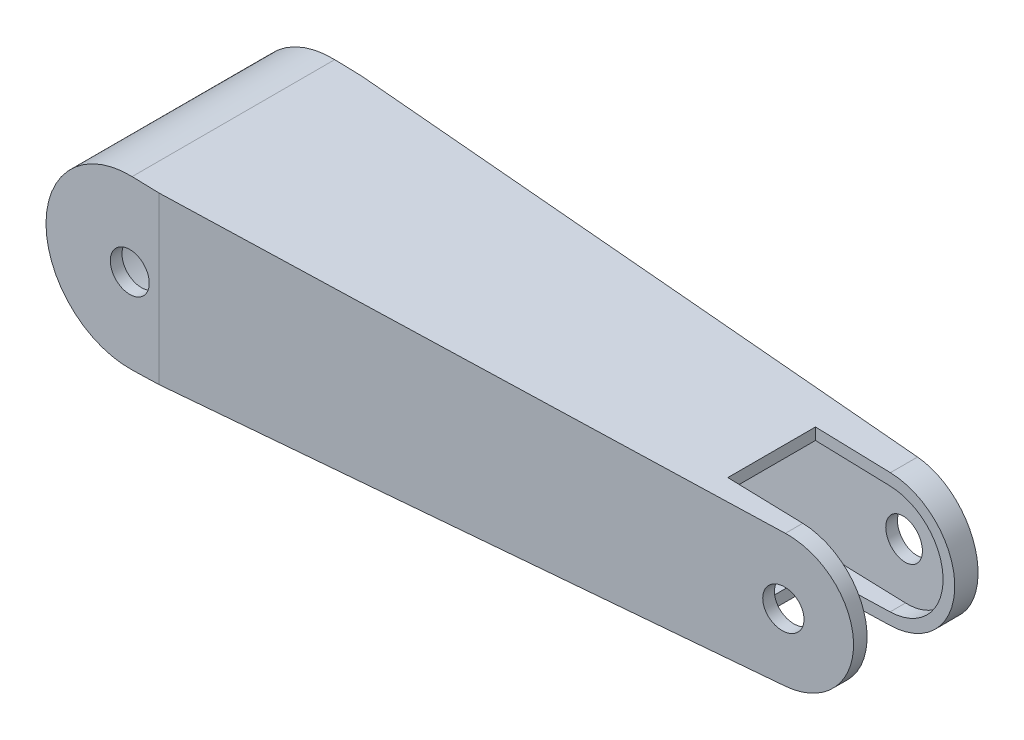
ISO-10303-21;
HEADER;
FILE_DESCRIPTION(('STEP AP214'),'2;1');
FILE_NAME('part.step','',(''),(''),'','','');
FILE_SCHEMA(('AUTOMOTIVE_DESIGN { 1 0 10303 214 1 1 1 1 }'));
ENDSEC;
DATA;
#1=APPLICATION_CONTEXT('core data for automotive mechanical design processes');
#2=APPLICATION_PROTOCOL_DEFINITION('international standard','automotive_design',2000,#1);
#3=PRODUCT_CONTEXT('',#1,'mechanical');
#4=PRODUCT('Part','Part','',(#3));
#5=PRODUCT_RELATED_PRODUCT_CATEGORY('part','',(#4));
#6=PRODUCT_DEFINITION_FORMATION('','',#4);
#7=PRODUCT_DEFINITION_CONTEXT('part definition',#1,'design');
#8=PRODUCT_DEFINITION('design','',#6,#7);
#9=PRODUCT_DEFINITION_SHAPE('','',#8);
#10=(LENGTH_UNIT() NAMED_UNIT(*) SI_UNIT(.MILLI.,.METRE.));
#11=(NAMED_UNIT(*) PLANE_ANGLE_UNIT() SI_UNIT($,.RADIAN.));
#12=(NAMED_UNIT(*) SI_UNIT($,.STERADIAN.) SOLID_ANGLE_UNIT());
#13=UNCERTAINTY_MEASURE_WITH_UNIT(LENGTH_MEASURE(1.E-05),#10,'distance_accuracy_value','');
#14=(GEOMETRIC_REPRESENTATION_CONTEXT(3) GLOBAL_UNCERTAINTY_ASSIGNED_CONTEXT((#13)) GLOBAL_UNIT_ASSIGNED_CONTEXT((#10,
#11,#12)) REPRESENTATION_CONTEXT('',''));
#15=CARTESIAN_POINT('',(0.,0.,0.));
#16=DIRECTION('',(0.,0.,1.));
#17=DIRECTION('',(1.,0.,0.));
#18=AXIS2_PLACEMENT_3D('',#15,#16,#17);
#19=CARTESIAN_POINT('',(210.710752688172,0.,200.));
#20=DIRECTION('',(0.,0.,-1.));
#21=DIRECTION('',(-1.,0.,0.));
#22=AXIS2_PLACEMENT_3D('',#19,#20,#21);
#23=CYLINDRICAL_SURFACE('',#22,28.);
#24=CARTESIAN_POINT('',(210.710752688172,0.,80.));
#25=DIRECTION('',(0.,0.,-1.));
#26=DIRECTION('',(-1.,0.,0.));
#27=AXIS2_PLACEMENT_3D('',#24,#25,#26);
#28=CIRCLE('',#27,28.);
#29=CARTESIAN_POINT('',(211.504453475574,27.9887484368287,80.));
#30=VERTEX_POINT('',#29);
#31=CARTESIAN_POINT('',(211.504453475574,-27.9887484368287,80.));
#32=VERTEX_POINT('',#31);
#33=EDGE_CURVE('E188',#30,#32,#28,.T.);
#34=ORIENTED_EDGE('',*,*,#33,.F.);
#35=DIRECTION('',(0.,0.,1.));
#36=VECTOR('',#35,1.);
#37=CARTESIAN_POINT('',(211.504453475574,27.9887484368287,200.));
#38=LINE('',#37,#36);
#39=CARTESIAN_POINT('',(211.504453475574,27.9887484368287,72.0727862655077));
#40=VERTEX_POINT('',#39);
#41=EDGE_CURVE('E293',#30,#40,#38,.F.);
#42=ORIENTED_EDGE('',*,*,#41,.T.);
#43=CARTESIAN_POINT('',(210.710752688172,0.,72.0255187248187));
#44=DIRECTION('',(0.0594480239556264,0.,-0.998231402254894));
#45=DIRECTION('',(-0.998231402254894,0.,-0.0594480239556264));
#46=AXIS2_PLACEMENT_3D('',#43,#44,#45);
#47=ELLIPSE('',#46,28.0496084742988,28.);
#48=CARTESIAN_POINT('',(211.504453475574,-27.9887484368287,72.0727862655077));
#49=VERTEX_POINT('',#48);
#50=EDGE_CURVE('E256',#40,#49,#47,.T.);
#51=ORIENTED_EDGE('',*,*,#50,.T.);
#52=DIRECTION('',(0.,0.,-1.));
#53=VECTOR('',#52,1.);
#54=CARTESIAN_POINT('',(211.504453475574,-27.9887484368287,200.));
#55=LINE('',#54,#53);
#56=EDGE_CURVE('E297',#32,#49,#55,.T.);
#57=ORIENTED_EDGE('',*,*,#56,.F.);
#58=EDGE_LOOP('',(#34,#42,#51,#57));
#59=FACE_BOUND('',#58,.T.);
#60=ADVANCED_FACE('F42',(#59),#23,.F.);
#61=CARTESIAN_POINT('',(-106.789247311828,0.,200.));
#62=DIRECTION('',(0.,0.,-1.));
#63=DIRECTION('',(-1.,0.,0.));
#64=AXIS2_PLACEMENT_3D('',#61,#62,#63);
#65=CYLINDRICAL_SURFACE('',#64,37.);
#66=DIRECTION('',(0.,0.,-1.));
#67=VECTOR('',#66,1.);
#68=CARTESIAN_POINT('',(-105.74042841419,36.9851318629521,200.));
#69=LINE('',#68,#67);
#70=CARTESIAN_POINT('',(-105.74042841419,36.9851318629521,146.));
#71=VERTEX_POINT('',#70);
#72=CARTESIAN_POINT('',(-105.74042841419,36.9851318629521,54.));
#73=VERTEX_POINT('',#72);
#74=EDGE_CURVE('E255',#71,#73,#69,.T.);
#75=ORIENTED_EDGE('',*,*,#74,.F.);
#76=CARTESIAN_POINT('',(-106.789247311828,0.,146.));
#77=DIRECTION('',(0.,0.,1.));
#78=DIRECTION('',(1.,0.,0.));
#79=AXIS2_PLACEMENT_3D('',#76,#77,#78);
#80=CIRCLE('',#79,37.);
#81=CARTESIAN_POINT('',(-105.74042841419,-36.9851318629521,146.));
#82=VERTEX_POINT('',#81);
#83=EDGE_CURVE('E281',#71,#82,#80,.T.);
#84=ORIENTED_EDGE('',*,*,#83,.T.);
#85=DIRECTION('',(0.,0.,1.));
#86=VECTOR('',#85,1.);
#87=CARTESIAN_POINT('',(-105.74042841419,-36.9851318629521,200.));
#88=LINE('',#87,#86);
#89=CARTESIAN_POINT('',(-105.74042841419,-36.9851318629521,54.));
#90=VERTEX_POINT('',#89);
#91=EDGE_CURVE('E298',#82,#90,#88,.F.);
#92=ORIENTED_EDGE('',*,*,#91,.T.);
#93=CARTESIAN_POINT('',(-106.789247311828,0.,54.));
#94=DIRECTION('',(0.,0.,-1.));
#95=DIRECTION('',(-1.,0.,0.));
#96=AXIS2_PLACEMENT_3D('',#93,#94,#95);
#97=CIRCLE('',#96,37.);
#98=EDGE_CURVE('E270',#90,#73,#97,.T.);
#99=ORIENTED_EDGE('',*,*,#98,.T.);
#100=EDGE_LOOP('',(#75,#84,#92,#99));
#101=FACE_BOUND('',#100,.T.);
#102=ADVANCED_FACE('F412',(#101),#65,.F.);
#103=CARTESIAN_POINT('',(-105.74042841419,-36.9851318629521,200.));
#104=DIRECTION('',(-0.0283464566929134,0.999598158458166,0.));
#105=DIRECTION('',(-0.999598158458166,-0.0283464566929134,0.));
#106=AXIS2_PLACEMENT_3D('',#103,#104,#105);
#107=PLANE('',#106);
#108=DIRECTION('',(-0.999598158458166,-0.0283464566929134,0.));
#109=VECTOR('',#108,1.);
#110=CARTESIAN_POINT('',(-105.74042841419,-36.9851318629521,80.));
#111=LINE('',#110,#109);
#112=CARTESIAN_POINT('',(173.210752688172,-29.0746755384309,80.));
#113=VERTEX_POINT('',#112);
#114=EDGE_CURVE('E326',#32,#113,#111,.T.);
#115=ORIENTED_EDGE('',*,*,#114,.F.);
#116=ORIENTED_EDGE('',*,*,#56,.T.);
#117=DIRECTION('',(-0.997831688181253,-0.0282963633901395,-0.0594242196435486));
#118=VECTOR('',#117,1.);
#119=CARTESIAN_POINT('',(-97.0346698745089,-36.7382552502494,53.6982479022273));
#120=LINE('',#119,#118);
#121=CARTESIAN_POINT('',(-91.9677492327423,-36.5945682643112,54.));
#122=VERTEX_POINT('',#121);
#123=EDGE_CURVE('E265',#49,#122,#120,.T.);
#124=ORIENTED_EDGE('',*,*,#123,.T.);
#125=DIRECTION('',(-0.999598158458166,-0.0283464566929134,0.));
#126=VECTOR('',#125,1.);
#127=CARTESIAN_POINT('',(-105.74042841419,-36.9851318629521,54.));
#128=LINE('',#127,#126);
#129=EDGE_CURVE('E272',#122,#90,#128,.T.);
#130=ORIENTED_EDGE('',*,*,#129,.T.);
#131=ORIENTED_EDGE('',*,*,#91,.F.);
#132=DIRECTION('',(0.999598158458166,0.0283464566929134,0.));
#133=VECTOR('',#132,1.);
#134=CARTESIAN_POINT('',(-105.74042841419,-36.9851318629521,146.));
#135=LINE('',#134,#133);
#136=CARTESIAN_POINT('',(-91.9677492327422,-36.5945682643112,146.));
#137=VERTEX_POINT('',#136);
#138=EDGE_CURVE('E288',#82,#137,#135,.T.);
#139=ORIENTED_EDGE('',*,*,#138,.T.);
#140=DIRECTION('',(0.997831688181253,0.0282963633901395,-0.0594242196435485));
#141=VECTOR('',#140,1.);
#142=CARTESIAN_POINT('',(-108.893743755664,-37.0745531128913,147.007999673822));
#143=LINE('',#142,#141);
#144=CARTESIAN_POINT('',(211.504453475574,-27.9887484368287,127.927213734492));
#145=VERTEX_POINT('',#144);
#146=EDGE_CURVE('E279',#137,#145,#143,.T.);
#147=ORIENTED_EDGE('',*,*,#146,.T.);
#148=CARTESIAN_POINT('',(211.504453475574,-27.9887484368287,125.));
#149=VERTEX_POINT('',#148);
#150=EDGE_CURVE('E294',#145,#149,#55,.T.);
#151=ORIENTED_EDGE('',*,*,#150,.T.);
#152=DIRECTION('',(0.999598158458166,0.0283464566929134,0.));
#153=VECTOR('',#152,1.);
#154=CARTESIAN_POINT('',(-105.74042841419,-36.9851318629521,125.));
#155=LINE('',#154,#153);
#156=CARTESIAN_POINT('',(173.210752688172,-29.0746755384309,125.));
#157=VERTEX_POINT('',#156);
#158=EDGE_CURVE('E356',#157,#149,#155,.T.);
#159=ORIENTED_EDGE('',*,*,#158,.F.);
#160=DIRECTION('',(0.,0.,1.));
#161=VECTOR('',#160,1.);
#162=CARTESIAN_POINT('',(173.210752688172,-29.0746755384309,200.));
#163=LINE('',#162,#161);
#164=EDGE_CURVE('E196',#113,#157,#163,.T.);
#165=ORIENTED_EDGE('',*,*,#164,.F.);
#166=EDGE_LOOP('',(#115,#116,#124,#130,#131,#139,#147,#151,#159,#165));
#167=FACE_BOUND('',#166,.T.);
#168=ADVANCED_FACE('F418',(#167),#107,.T.);
#169=CARTESIAN_POINT('',(210.710752688172,0.,125.));
#170=DIRECTION('',(0.,0.,1.));
#171=DIRECTION('',(1.,0.,0.));
#172=AXIS2_PLACEMENT_3D('',#169,#170,#171);
#173=CIRCLE('',#172,28.);
#174=CARTESIAN_POINT('',(211.504453475574,27.9887484368287,125.));
#175=VERTEX_POINT('',#174);
#176=EDGE_CURVE('E64',#149,#175,#173,.T.);
#177=ORIENTED_EDGE('',*,*,#176,.F.);
#178=ORIENTED_EDGE('',*,*,#150,.F.);
#179=CARTESIAN_POINT('',(210.710752688172,0.,127.974481275181));
#180=DIRECTION('',(0.0594480239556264,0.,0.998231402254894));
#181=DIRECTION('',(0.998231402254894,0.,-0.0594480239556264));
#182=AXIS2_PLACEMENT_3D('',#179,#180,#181);
#183=ELLIPSE('',#182,28.0496084742988,28.);
#184=CARTESIAN_POINT('',(211.504453475574,27.9887484368287,127.927213734492));
#185=VERTEX_POINT('',#184);
#186=EDGE_CURVE('E277',#145,#185,#183,.T.);
#187=ORIENTED_EDGE('',*,*,#186,.T.);
#188=EDGE_CURVE('E290',#185,#175,#38,.F.);
#189=ORIENTED_EDGE('',*,*,#188,.T.);
#190=EDGE_LOOP('',(#177,#178,#187,#189));
#191=FACE_BOUND('',#190,.T.);
#192=ADVANCED_FACE('F414',(#191),#23,.F.);
#193=CARTESIAN_POINT('',(-105.74042841419,36.9851318629521,200.));
#194=DIRECTION('',(-0.0283464566929134,-0.999598158458166,0.));
#195=DIRECTION('',(0.999598158458166,-0.0283464566929134,0.));
#196=AXIS2_PLACEMENT_3D('',#193,#194,#195);
#197=PLANE('',#196);
#198=DIRECTION('',(0.999598158458166,-0.0283464566929134,0.));
#199=VECTOR('',#198,1.);
#200=CARTESIAN_POINT('',(-105.74042841419,36.9851318629521,80.));
#201=LINE('',#200,#199);
#202=CARTESIAN_POINT('',(173.210752688172,29.0746755384309,80.));
#203=VERTEX_POINT('',#202);
#204=EDGE_CURVE('E12',#203,#30,#201,.T.);
#205=ORIENTED_EDGE('',*,*,#204,.F.);
#206=DIRECTION('',(0.,0.,-1.));
#207=VECTOR('',#206,1.);
#208=CARTESIAN_POINT('',(173.210752688172,29.0746755384309,200.));
#209=LINE('',#208,#207);
#210=CARTESIAN_POINT('',(173.210752688172,29.0746755384309,125.));
#211=VERTEX_POINT('',#210);
#212=EDGE_CURVE('E51',#211,#203,#209,.T.);
#213=ORIENTED_EDGE('',*,*,#212,.F.);
#214=DIRECTION('',(-0.999598158458166,0.0283464566929134,0.));
#215=VECTOR('',#214,1.);
#216=CARTESIAN_POINT('',(-105.74042841419,36.9851318629521,125.));
#217=LINE('',#216,#215);
#218=EDGE_CURVE('E259',#175,#211,#217,.T.);
#219=ORIENTED_EDGE('',*,*,#218,.F.);
#220=ORIENTED_EDGE('',*,*,#188,.F.);
#221=DIRECTION('',(-0.997831688181253,0.0282963633901395,0.0594242196435485));
#222=VECTOR('',#221,1.);
#223=CARTESIAN_POINT('',(-108.893743755664,37.0745531128913,147.007999673822));
#224=LINE('',#223,#222);
#225=CARTESIAN_POINT('',(-91.9677492327422,36.5945682643112,146.));
#226=VERTEX_POINT('',#225);
#227=EDGE_CURVE('E274',#185,#226,#224,.T.);
#228=ORIENTED_EDGE('',*,*,#227,.T.);
#229=DIRECTION('',(-0.999598158458166,0.0283464566929134,0.));
#230=VECTOR('',#229,1.);
#231=CARTESIAN_POINT('',(-105.74042841419,36.9851318629521,146.));
#232=LINE('',#231,#230);
#233=EDGE_CURVE('E283',#226,#71,#232,.T.);
#234=ORIENTED_EDGE('',*,*,#233,.T.);
#235=ORIENTED_EDGE('',*,*,#74,.T.);
#236=DIRECTION('',(0.999598158458166,-0.0283464566929134,0.));
#237=VECTOR('',#236,1.);
#238=CARTESIAN_POINT('',(-105.74042841419,36.9851318629521,54.));
#239=LINE('',#238,#237);
#240=CARTESIAN_POINT('',(-91.9677492327423,36.5945682643112,54.));
#241=VERTEX_POINT('',#240);
#242=EDGE_CURVE('E267',#73,#241,#239,.T.);
#243=ORIENTED_EDGE('',*,*,#242,.T.);
#244=DIRECTION('',(0.997831688181253,-0.0282963633901395,0.0594242196435486));
#245=VECTOR('',#244,1.);
#246=CARTESIAN_POINT('',(-97.0346698745089,36.7382552502494,53.6982479022273));
#247=LINE('',#246,#245);
#248=EDGE_CURVE('E260',#241,#40,#247,.T.);
#249=ORIENTED_EDGE('',*,*,#248,.T.);
#250=ORIENTED_EDGE('',*,*,#41,.F.);
#251=EDGE_LOOP('',(#205,#213,#219,#220,#228,#234,#235,#243,#249,#250));
#252=FACE_BOUND('',#251,.T.);
#253=ADVANCED_FACE('F319',(#252),#197,.T.);
#254=CARTESIAN_POINT('',(-158.789247311828,-43.,146.));
#255=DIRECTION('',(0.,0.,1.));
#256=DIRECTION('',(1.,0.,0.));
#257=AXIS2_PLACEMENT_3D('',#254,#255,#256);
#258=PLANE('',#257);
#259=CARTESIAN_POINT('',(-106.789247311828,0.,146.));
#260=DIRECTION('',(0.,0.,1.));
#261=DIRECTION('',(1.,0.,0.));
#262=AXIS2_PLACEMENT_3D('',#259,#260,#261);
#263=CIRCLE('',#262,9.99999999999999);
#264=CARTESIAN_POINT('',(-96.789247311828,0.,146.));
#265=VERTEX_POINT('',#264);
#266=EDGE_CURVE('E370',#265,#265,#263,.T.);
#267=ORIENTED_EDGE('',*,*,#266,.T.);
#268=EDGE_LOOP('',(#267));
#269=FACE_BOUND('',#268,.T.);
#270=ORIENTED_EDGE('',*,*,#138,.F.);
#271=ORIENTED_EDGE('',*,*,#83,.F.);
#272=ORIENTED_EDGE('',*,*,#233,.F.);
#273=DIRECTION('',(0.,1.,0.));
#274=VECTOR('',#273,1.);
#275=CARTESIAN_POINT('',(-91.9677492327422,-43.,146.));
#276=LINE('',#275,#274);
#277=EDGE_CURVE('E286',#137,#226,#276,.T.);
#278=ORIENTED_EDGE('',*,*,#277,.F.);
#279=EDGE_LOOP('',(#270,#271,#272,#278));
#280=FACE_BOUND('',#279,.T.);
#281=ADVANCED_FACE('F428',(#269,#280),#258,.F.);
#282=CARTESIAN_POINT('',(-92.1459354555617,-43.,146.010611586471));
#283=DIRECTION('',(0.0594480239556264,0.,0.998231402254894));
#284=DIRECTION('',(0.998231402254894,0.,-0.0594480239556264));
#285=AXIS2_PLACEMENT_3D('',#282,#283,#284);
#286=PLANE('',#285);
#287=CARTESIAN_POINT('',(210.710752688172,0.,127.974481275181));
#288=DIRECTION('',(0.0594480239556264,0.,0.998231402254894));
#289=DIRECTION('',(-0.998231402254894,0.,0.0594480239556264));
#290=AXIS2_PLACEMENT_3D('',#287,#288,#289);
#291=ELLIPSE('',#290,10.0177173122496,10.);
#292=CARTESIAN_POINT('',(200.710752688172,0.,128.570014773941));
#293=VERTEX_POINT('',#292);
#294=EDGE_CURVE('E360',#293,#293,#291,.T.);
#295=ORIENTED_EDGE('',*,*,#294,.T.);
#296=EDGE_LOOP('',(#295));
#297=FACE_BOUND('',#296,.T.);
#298=ORIENTED_EDGE('',*,*,#146,.F.);
#299=ORIENTED_EDGE('',*,*,#277,.T.);
#300=ORIENTED_EDGE('',*,*,#227,.F.);
#301=ORIENTED_EDGE('',*,*,#186,.F.);
#302=EDGE_LOOP('',(#298,#299,#300,#301));
#303=FACE_BOUND('',#302,.T.);
#304=ADVANCED_FACE('F439',(#297,#303),#286,.F.);
#305=CARTESIAN_POINT('',(-158.789247311828,-43.,54.));
#306=DIRECTION('',(0.,0.,-1.));
#307=DIRECTION('',(-1.,0.,0.));
#308=AXIS2_PLACEMENT_3D('',#305,#306,#307);
#309=PLANE('',#308);
#310=CARTESIAN_POINT('',(-106.789247311828,0.,54.));
#311=DIRECTION('',(0.,0.,-1.));
#312=DIRECTION('',(-1.,0.,0.));
#313=AXIS2_PLACEMENT_3D('',#310,#311,#312);
#314=CIRCLE('',#313,9.99999999999999);
#315=CARTESIAN_POINT('',(-116.789247311828,0.,54.));
#316=VERTEX_POINT('',#315);
#317=EDGE_CURVE('E373',#316,#316,#314,.T.);
#318=ORIENTED_EDGE('',*,*,#317,.T.);
#319=EDGE_LOOP('',(#318));
#320=FACE_BOUND('',#319,.T.);
#321=ORIENTED_EDGE('',*,*,#129,.F.);
#322=DIRECTION('',(0.,1.,0.));
#323=VECTOR('',#322,1.);
#324=CARTESIAN_POINT('',(-91.9677492327423,-43.,54.));
#325=LINE('',#324,#323);
#326=EDGE_CURVE('E263',#122,#241,#325,.T.);
#327=ORIENTED_EDGE('',*,*,#326,.T.);
#328=ORIENTED_EDGE('',*,*,#242,.F.);
#329=ORIENTED_EDGE('',*,*,#98,.F.);
#330=EDGE_LOOP('',(#321,#327,#328,#329));
#331=FACE_BOUND('',#330,.T.);
#332=ADVANCED_FACE('F449',(#320,#331),#309,.F.);
#333=CARTESIAN_POINT('',(-92.1459354555617,-43.,53.9893884135294));
#334=DIRECTION('',(0.0594480239556264,0.,-0.998231402254894));
#335=DIRECTION('',(-0.998231402254894,0.,-0.0594480239556264));
#336=AXIS2_PLACEMENT_3D('',#333,#334,#335);
#337=PLANE('',#336);
#338=CARTESIAN_POINT('',(210.710752688172,0.,72.0255187248187));
#339=DIRECTION('',(0.0594480239556264,0.,-0.998231402254894));
#340=DIRECTION('',(0.998231402254894,0.,0.0594480239556264));
#341=AXIS2_PLACEMENT_3D('',#338,#339,#340);
#342=ELLIPSE('',#341,10.0177173122496,10.);
#343=CARTESIAN_POINT('',(220.710752688172,0.,72.621052223578));
#344=VERTEX_POINT('',#343);
#345=EDGE_CURVE('E364',#344,#344,#342,.T.);
#346=ORIENTED_EDGE('',*,*,#345,.T.);
#347=EDGE_LOOP('',(#346));
#348=FACE_BOUND('',#347,.T.);
#349=ORIENTED_EDGE('',*,*,#123,.F.);
#350=ORIENTED_EDGE('',*,*,#50,.F.);
#351=ORIENTED_EDGE('',*,*,#248,.F.);
#352=ORIENTED_EDGE('',*,*,#326,.F.);
#353=EDGE_LOOP('',(#349,#350,#351,#352));
#354=FACE_BOUND('',#353,.T.);
#355=ADVANCED_FACE('F44',(#348,#354),#337,.F.);
#356=CARTESIAN_POINT('',(173.210752688172,-43.,80.));
#357=DIRECTION('',(-1.,0.,0.));
#358=DIRECTION('',(0.,0.,1.));
#359=AXIS2_PLACEMENT_3D('',#356,#357,#358);
#360=PLANE('',#359);
#361=DIRECTION('',(0.,1.,0.));
#362=VECTOR('',#361,1.);
#363=CARTESIAN_POINT('',(173.210752688172,-43.,80.));
#364=LINE('',#363,#362);
#365=CARTESIAN_POINT('',(173.210752688172,-35.0770875569312,80.));
#366=VERTEX_POINT('',#365);
#367=EDGE_CURVE('E316',#366,#113,#364,.T.);
#368=ORIENTED_EDGE('',*,*,#367,.T.);
#369=ORIENTED_EDGE('',*,*,#164,.T.);
#370=DIRECTION('',(0.,1.,0.));
#371=VECTOR('',#370,1.);
#372=CARTESIAN_POINT('',(173.210752688172,-43.,125.));
#373=LINE('',#372,#371);
#374=CARTESIAN_POINT('',(173.210752688172,-35.0770875569312,125.));
#375=VERTEX_POINT('',#374);
#376=EDGE_CURVE('E180',#375,#157,#373,.T.);
#377=ORIENTED_EDGE('',*,*,#376,.F.);
#378=DIRECTION('',(0.,0.,1.));
#379=VECTOR('',#378,1.);
#380=CARTESIAN_POINT('',(173.210752688172,-35.0770875569312,200.));
#381=LINE('',#380,#379);
#382=EDGE_CURVE('E193',#366,#375,#381,.T.);
#383=ORIENTED_EDGE('',*,*,#382,.F.);
#384=EDGE_LOOP('',(#368,#369,#377,#383));
#385=FACE_BOUND('',#384,.T.);
#386=ADVANCED_FACE('F192',(#385),#360,.F.);
#387=CARTESIAN_POINT('',(173.210752688172,35.0770875569312,125.));
#388=VERTEX_POINT('',#387);
#389=EDGE_CURVE('E58',#211,#388,#373,.T.);
#390=ORIENTED_EDGE('',*,*,#389,.F.);
#391=ORIENTED_EDGE('',*,*,#212,.T.);
#392=CARTESIAN_POINT('',(173.210752688172,35.0770875569312,80.));
#393=VERTEX_POINT('',#392);
#394=EDGE_CURVE('E197',#203,#393,#364,.T.);
#395=ORIENTED_EDGE('',*,*,#394,.T.);
#396=DIRECTION('',(0.,0.,-1.));
#397=VECTOR('',#396,1.);
#398=CARTESIAN_POINT('',(173.210752688172,35.0770875569312,200.));
#399=LINE('',#398,#397);
#400=EDGE_CURVE('E204',#388,#393,#399,.T.);
#401=ORIENTED_EDGE('',*,*,#400,.F.);
#402=EDGE_LOOP('',(#390,#391,#395,#401));
#403=FACE_BOUND('',#402,.T.);
#404=ADVANCED_FACE('F308',(#403),#360,.F.);
#405=CARTESIAN_POINT('',(173.210752688172,-43.,80.));
#406=DIRECTION('',(0.,0.,-1.));
#407=DIRECTION('',(-1.,0.,0.));
#408=AXIS2_PLACEMENT_3D('',#405,#406,#407);
#409=PLANE('',#408);
#410=CARTESIAN_POINT('',(210.710752688172,0.,80.));
#411=DIRECTION('',(0.,0.,-1.));
#412=DIRECTION('',(-1.,0.,0.));
#413=AXIS2_PLACEMENT_3D('',#410,#411,#412);
#414=CIRCLE('',#413,34.);
#415=CARTESIAN_POINT('',(211.674532215731,33.9863373875777,80.));
#416=VERTEX_POINT('',#415);
#417=CARTESIAN_POINT('',(211.674532215731,-33.9863373875777,80.));
#418=VERTEX_POINT('',#417);
#419=EDGE_CURVE('E332',#416,#418,#414,.T.);
#420=ORIENTED_EDGE('',*,*,#419,.F.);
#421=DIRECTION('',(0.999598158458166,-0.0283464566929134,0.));
#422=VECTOR('',#421,1.);
#423=CARTESIAN_POINT('',(-105.570349674033,42.9827208137011,80.));
#424=LINE('',#423,#422);
#425=EDGE_CURVE('E315',#393,#416,#424,.T.);
#426=ORIENTED_EDGE('',*,*,#425,.F.);
#427=ORIENTED_EDGE('',*,*,#394,.F.);
#428=ORIENTED_EDGE('',*,*,#204,.T.);
#429=ORIENTED_EDGE('',*,*,#33,.T.);
#430=ORIENTED_EDGE('',*,*,#114,.T.);
#431=ORIENTED_EDGE('',*,*,#367,.F.);
#432=DIRECTION('',(-0.999598158458166,-0.0283464566929134,0.));
#433=VECTOR('',#432,1.);
#434=CARTESIAN_POINT('',(-105.570349674033,-42.9827208137011,80.));
#435=LINE('',#434,#433);
#436=EDGE_CURVE('E202',#418,#366,#435,.T.);
#437=ORIENTED_EDGE('',*,*,#436,.F.);
#438=EDGE_LOOP('',(#420,#426,#427,#428,#429,#430,#431,#437));
#439=FACE_BOUND('',#438,.T.);
#440=ADVANCED_FACE('F312',(#439),#409,.F.);
#441=CARTESIAN_POINT('',(173.210752688172,-43.,125.));
#442=DIRECTION('',(0.,0.,1.));
#443=DIRECTION('',(1.,0.,0.));
#444=AXIS2_PLACEMENT_3D('',#441,#442,#443);
#445=PLANE('',#444);
#446=ORIENTED_EDGE('',*,*,#376,.T.);
#447=ORIENTED_EDGE('',*,*,#158,.T.);
#448=ORIENTED_EDGE('',*,*,#176,.T.);
#449=ORIENTED_EDGE('',*,*,#218,.T.);
#450=ORIENTED_EDGE('',*,*,#389,.T.);
#451=DIRECTION('',(-0.999598158458166,0.0283464566929134,0.));
#452=VECTOR('',#451,1.);
#453=CARTESIAN_POINT('',(-105.570349674033,42.9827208137011,125.));
#454=LINE('',#453,#452);
#455=CARTESIAN_POINT('',(211.674532215731,33.9863373875777,125.));
#456=VERTEX_POINT('',#455);
#457=EDGE_CURVE('E353',#456,#388,#454,.T.);
#458=ORIENTED_EDGE('',*,*,#457,.F.);
#459=CARTESIAN_POINT('',(210.710752688172,0.,125.));
#460=DIRECTION('',(0.,0.,1.));
#461=DIRECTION('',(1.,0.,0.));
#462=AXIS2_PLACEMENT_3D('',#459,#460,#461);
#463=CIRCLE('',#462,34.);
#464=CARTESIAN_POINT('',(211.674532215731,-33.9863373875777,125.));
#465=VERTEX_POINT('',#464);
#466=EDGE_CURVE('E183',#465,#456,#463,.T.);
#467=ORIENTED_EDGE('',*,*,#466,.F.);
#468=DIRECTION('',(0.999598158458166,0.0283464566929134,0.));
#469=VECTOR('',#468,1.);
#470=CARTESIAN_POINT('',(-105.570349674033,-42.9827208137011,125.));
#471=LINE('',#470,#469);
#472=EDGE_CURVE('E177',#375,#465,#471,.T.);
#473=ORIENTED_EDGE('',*,*,#472,.F.);
#474=EDGE_LOOP('',(#446,#447,#448,#449,#450,#458,#467,#473));
#475=FACE_BOUND('',#474,.T.);
#476=ADVANCED_FACE('F179',(#475),#445,.F.);
#477=CARTESIAN_POINT('',(210.710752688172,0.,200.));
#478=DIRECTION('',(0.,0.,-1.));
#479=DIRECTION('',(-1.,0.,0.));
#480=AXIS2_PLACEMENT_3D('',#477,#478,#479);
#481=CYLINDRICAL_SURFACE('',#480,34.);
#482=DIRECTION('',(0.,0.,-1.));
#483=VECTOR('',#482,1.);
#484=CARTESIAN_POINT('',(211.674532215731,33.9863373875777,200.));
#485=LINE('',#484,#483);
#486=CARTESIAN_POINT('',(211.674532215731,33.9863373875777,66.072284636877));
#487=VERTEX_POINT('',#486);
#488=EDGE_CURVE('E233',#416,#487,#485,.T.);
#489=ORIENTED_EDGE('',*,*,#488,.F.);
#490=ORIENTED_EDGE('',*,*,#419,.T.);
#491=DIRECTION('',(0.,0.,-1.));
#492=VECTOR('',#491,1.);
#493=CARTESIAN_POINT('',(211.674532215731,-33.9863373875777,200.));
#494=LINE('',#493,#492);
#495=CARTESIAN_POINT('',(211.674532215731,-33.9863373875777,66.072284636877));
#496=VERTEX_POINT('',#495);
#497=EDGE_CURVE('E237',#418,#496,#494,.T.);
#498=ORIENTED_EDGE('',*,*,#497,.T.);
#499=CARTESIAN_POINT('',(210.710752688172,0.,66.014888337469));
#500=DIRECTION('',(0.0594480239556264,0.,-0.998231402254894));
#501=DIRECTION('',(-0.998231402254894,0.,-0.0594480239556264));
#502=AXIS2_PLACEMENT_3D('',#499,#500,#501);
#503=ELLIPSE('',#502,34.0602388616485,34.);
#504=EDGE_CURVE('E221',#487,#496,#503,.T.);
#505=ORIENTED_EDGE('',*,*,#504,.F.);
#506=EDGE_LOOP('',(#489,#490,#498,#505));
#507=FACE_BOUND('',#506,.T.);
#508=ADVANCED_FACE('F337',(#507),#481,.T.);
#509=CARTESIAN_POINT('',(-106.789247311828,0.,200.));
#510=DIRECTION('',(0.,0.,-1.));
#511=DIRECTION('',(-1.,0.,0.));
#512=AXIS2_PLACEMENT_3D('',#509,#510,#511);
#513=CYLINDRICAL_SURFACE('',#512,43.);
#514=DIRECTION('',(0.,0.,-1.));
#515=VECTOR('',#514,1.);
#516=CARTESIAN_POINT('',(-105.570349674033,42.9827208137011,200.));
#517=LINE('',#516,#515);
#518=CARTESIAN_POINT('',(-105.570349674033,42.9827208137011,152.));
#519=VERTEX_POINT('',#518);
#520=CARTESIAN_POINT('',(-105.570349674033,42.9827208137011,48.));
#521=VERTEX_POINT('',#520);
#522=EDGE_CURVE('E230',#519,#521,#517,.T.);
#523=ORIENTED_EDGE('',*,*,#522,.T.);
#524=CARTESIAN_POINT('',(-106.789247311828,0.,48.));
#525=DIRECTION('',(0.,0.,-1.));
#526=DIRECTION('',(-1.,0.,0.));
#527=AXIS2_PLACEMENT_3D('',#524,#525,#526);
#528=CIRCLE('',#527,43.);
#529=CARTESIAN_POINT('',(-105.570349674033,-42.9827208137011,48.));
#530=VERTEX_POINT('',#529);
#531=EDGE_CURVE('E226',#530,#521,#528,.T.);
#532=ORIENTED_EDGE('',*,*,#531,.F.);
#533=DIRECTION('',(0.,0.,-1.));
#534=VECTOR('',#533,1.);
#535=CARTESIAN_POINT('',(-105.570349674033,-42.9827208137011,200.));
#536=LINE('',#535,#534);
#537=CARTESIAN_POINT('',(-105.570349674033,-42.9827208137011,152.));
#538=VERTEX_POINT('',#537);
#539=EDGE_CURVE('E240',#538,#530,#536,.T.);
#540=ORIENTED_EDGE('',*,*,#539,.F.);
#541=CARTESIAN_POINT('',(-106.789247311828,0.,152.));
#542=DIRECTION('',(0.,0.,1.));
#543=DIRECTION('',(1.,0.,0.));
#544=AXIS2_PLACEMENT_3D('',#541,#542,#543);
#545=CIRCLE('',#544,43.);
#546=EDGE_CURVE('E212',#519,#538,#545,.T.);
#547=ORIENTED_EDGE('',*,*,#546,.F.);
#548=EDGE_LOOP('',(#523,#532,#540,#547));
#549=FACE_BOUND('',#548,.T.);
#550=ADVANCED_FACE('F401',(#549),#513,.T.);
#551=CARTESIAN_POINT('',(-105.570349674033,-42.9827208137011,200.));
#552=DIRECTION('',(-0.0283464566929134,0.999598158458166,0.));
#553=DIRECTION('',(-0.999598158458166,-0.0283464566929134,0.));
#554=AXIS2_PLACEMENT_3D('',#551,#552,#553);
#555=PLANE('',#554);
#556=ORIENTED_EDGE('',*,*,#497,.F.);
#557=ORIENTED_EDGE('',*,*,#436,.T.);
#558=ORIENTED_EDGE('',*,*,#382,.T.);
#559=ORIENTED_EDGE('',*,*,#472,.T.);
#560=CARTESIAN_POINT('',(211.674532215731,-33.9863373875777,133.927715363123));
#561=VERTEX_POINT('',#560);
#562=EDGE_CURVE('E238',#561,#465,#494,.T.);
#563=ORIENTED_EDGE('',*,*,#562,.F.);
#564=DIRECTION('',(0.997831688181253,0.0282963633901395,-0.0594242196435485));
#565=VECTOR('',#564,1.);
#566=CARTESIAN_POINT('',(-108.367863054817,-43.0620522842778,152.987312103801));
#567=LINE('',#566,#565);
#568=CARTESIAN_POINT('',(-91.789247311828,-42.5919183517464,152.));
#569=VERTEX_POINT('',#568);
#570=EDGE_CURVE('E219',#569,#561,#567,.T.);
#571=ORIENTED_EDGE('',*,*,#570,.F.);
#572=DIRECTION('',(0.999598158458166,0.0283464566929134,0.));
#573=VECTOR('',#572,1.);
#574=CARTESIAN_POINT('',(-105.570349674033,-42.9827208137011,152.));
#575=LINE('',#574,#573);
#576=EDGE_CURVE('E215',#538,#569,#575,.T.);
#577=ORIENTED_EDGE('',*,*,#576,.F.);
#578=ORIENTED_EDGE('',*,*,#539,.T.);
#579=DIRECTION('',(-0.999598158458166,-0.0283464566929134,0.));
#580=VECTOR('',#579,1.);
#581=CARTESIAN_POINT('',(-105.570349674033,-42.9827208137011,48.));
#582=LINE('',#581,#580);
#583=CARTESIAN_POINT('',(-91.789247311828,-42.5919183517464,48.));
#584=VERTEX_POINT('',#583);
#585=EDGE_CURVE('E228',#584,#530,#582,.T.);
#586=ORIENTED_EDGE('',*,*,#585,.F.);
#587=DIRECTION('',(-0.997831688181253,-0.0282963633901395,-0.0594242196435486));
#588=VECTOR('',#587,1.);
#589=CARTESIAN_POINT('',(-96.5087891736619,-42.725754421636,47.7189354722481));
#590=LINE('',#589,#588);
#591=EDGE_CURVE('E224',#496,#584,#590,.T.);
#592=ORIENTED_EDGE('',*,*,#591,.F.);
#593=EDGE_LOOP('',(#556,#557,#558,#559,#563,#571,#577,#578,#586,#592));
#594=FACE_BOUND('',#593,.T.);
#595=ADVANCED_FACE('F201',(#594),#555,.F.);
#596=ORIENTED_EDGE('',*,*,#562,.T.);
#597=ORIENTED_EDGE('',*,*,#466,.T.);
#598=CARTESIAN_POINT('',(211.674532215731,33.9863373875777,133.927715363123));
#599=VERTEX_POINT('',#598);
#600=EDGE_CURVE('E234',#599,#456,#485,.T.);
#601=ORIENTED_EDGE('',*,*,#600,.F.);
#602=CARTESIAN_POINT('',(210.710752688172,0.,133.985111662531));
#603=DIRECTION('',(0.0594480239556264,0.,0.998231402254894));
#604=DIRECTION('',(0.998231402254894,0.,-0.0594480239556264));
#605=AXIS2_PLACEMENT_3D('',#602,#603,#604);
#606=ELLIPSE('',#605,34.0602388616485,34.);
#607=EDGE_CURVE('E217',#561,#599,#606,.T.);
#608=ORIENTED_EDGE('',*,*,#607,.F.);
#609=EDGE_LOOP('',(#596,#597,#601,#608));
#610=FACE_BOUND('',#609,.T.);
#611=ADVANCED_FACE('F399',(#610),#481,.T.);
#612=CARTESIAN_POINT('',(-105.570349674033,42.9827208137011,200.));
#613=DIRECTION('',(-0.0283464566929134,-0.999598158458166,0.));
#614=DIRECTION('',(0.999598158458166,-0.0283464566929134,0.));
#615=AXIS2_PLACEMENT_3D('',#612,#613,#614);
#616=PLANE('',#615);
#617=ORIENTED_EDGE('',*,*,#400,.T.);
#618=ORIENTED_EDGE('',*,*,#425,.T.);
#619=ORIENTED_EDGE('',*,*,#488,.T.);
#620=DIRECTION('',(0.997831688181253,-0.0282963633901395,0.0594242196435486));
#621=VECTOR('',#620,1.);
#622=CARTESIAN_POINT('',(-96.5087891736619,42.725754421636,47.7189354722481));
#623=LINE('',#622,#621);
#624=CARTESIAN_POINT('',(-91.789247311828,42.5919183517464,48.));
#625=VERTEX_POINT('',#624);
#626=EDGE_CURVE('E249',#625,#487,#623,.T.);
#627=ORIENTED_EDGE('',*,*,#626,.F.);
#628=DIRECTION('',(0.999598158458166,-0.0283464566929134,0.));
#629=VECTOR('',#628,1.);
#630=CARTESIAN_POINT('',(-105.570349674033,42.9827208137011,48.));
#631=LINE('',#630,#629);
#632=EDGE_CURVE('E252',#521,#625,#631,.T.);
#633=ORIENTED_EDGE('',*,*,#632,.F.);
#634=ORIENTED_EDGE('',*,*,#522,.F.);
#635=DIRECTION('',(-0.999598158458166,0.0283464566929134,0.));
#636=VECTOR('',#635,1.);
#637=CARTESIAN_POINT('',(-105.570349674033,42.9827208137011,152.));
#638=LINE('',#637,#636);
#639=CARTESIAN_POINT('',(-91.789247311828,42.5919183517464,152.));
#640=VERTEX_POINT('',#639);
#641=EDGE_CURVE('E243',#640,#519,#638,.T.);
#642=ORIENTED_EDGE('',*,*,#641,.F.);
#643=DIRECTION('',(-0.997831688181253,0.0282963633901395,0.0594242196435485));
#644=VECTOR('',#643,1.);
#645=CARTESIAN_POINT('',(-108.367863054817,43.0620522842778,152.987312103801));
#646=LINE('',#645,#644);
#647=EDGE_CURVE('E246',#599,#640,#646,.T.);
#648=ORIENTED_EDGE('',*,*,#647,.F.);
#649=ORIENTED_EDGE('',*,*,#600,.T.);
#650=ORIENTED_EDGE('',*,*,#457,.T.);
#651=EDGE_LOOP('',(#617,#618,#619,#627,#633,#634,#642,#648,#649,#650));
#652=FACE_BOUND('',#651,.T.);
#653=ADVANCED_FACE('F351',(#652),#616,.F.);
#654=CARTESIAN_POINT('',(-158.789247311828,-43.,152.));
#655=DIRECTION('',(0.,0.,1.));
#656=DIRECTION('',(1.,0.,0.));
#657=AXIS2_PLACEMENT_3D('',#654,#655,#656);
#658=PLANE('',#657);
#659=CARTESIAN_POINT('',(-106.789247311828,0.,152.));
#660=DIRECTION('',(0.,0.,1.));
#661=DIRECTION('',(1.,0.,0.));
#662=AXIS2_PLACEMENT_3D('',#659,#660,#661);
#663=CIRCLE('',#662,9.99999999999999);
#664=CARTESIAN_POINT('',(-96.789247311828,0.,152.));
#665=VERTEX_POINT('',#664);
#666=EDGE_CURVE('E379',#665,#665,#663,.T.);
#667=ORIENTED_EDGE('',*,*,#666,.F.);
#668=EDGE_LOOP('',(#667));
#669=FACE_BOUND('',#668,.T.);
#670=ORIENTED_EDGE('',*,*,#576,.T.);
#671=DIRECTION('',(0.,1.,0.));
#672=VECTOR('',#671,1.);
#673=CARTESIAN_POINT('',(-91.789247311828,-43.,152.));
#674=LINE('',#673,#672);
#675=EDGE_CURVE('E203',#569,#640,#674,.T.);
#676=ORIENTED_EDGE('',*,*,#675,.T.);
#677=ORIENTED_EDGE('',*,*,#641,.T.);
#678=ORIENTED_EDGE('',*,*,#546,.T.);
#679=EDGE_LOOP('',(#670,#676,#677,#678));
#680=FACE_BOUND('',#679,.T.);
#681=ADVANCED_FACE('F386',(#669,#680),#658,.T.);
#682=CARTESIAN_POINT('',(-91.789247311828,-43.,152.));
#683=DIRECTION('',(0.0594480239556264,0.,0.998231402254894));
#684=DIRECTION('',(0.998231402254894,0.,-0.0594480239556264));
#685=AXIS2_PLACEMENT_3D('',#682,#683,#684);
#686=PLANE('',#685);
#687=CARTESIAN_POINT('',(210.710752688172,0.,133.985111662531));
#688=DIRECTION('',(0.0594480239556264,0.,0.998231402254894));
#689=DIRECTION('',(-0.998231402254894,0.,0.0594480239556264));
#690=AXIS2_PLACEMENT_3D('',#687,#688,#689);
#691=ELLIPSE('',#690,10.0177173122496,10.);
#692=CARTESIAN_POINT('',(200.710752688172,0.,134.58064516129));
#693=VERTEX_POINT('',#692);
#694=EDGE_CURVE('E367',#693,#693,#691,.T.);
#695=ORIENTED_EDGE('',*,*,#694,.F.);
#696=EDGE_LOOP('',(#695));
#697=FACE_BOUND('',#696,.T.);
#698=ORIENTED_EDGE('',*,*,#570,.T.);
#699=ORIENTED_EDGE('',*,*,#607,.T.);
#700=ORIENTED_EDGE('',*,*,#647,.T.);
#701=ORIENTED_EDGE('',*,*,#675,.F.);
#702=EDGE_LOOP('',(#698,#699,#700,#701));
#703=FACE_BOUND('',#702,.T.);
#704=ADVANCED_FACE('F389',(#697,#703),#686,.T.);
#705=CARTESIAN_POINT('',(-158.789247311828,-43.,48.));
#706=DIRECTION('',(0.,0.,-1.));
#707=DIRECTION('',(-1.,0.,0.));
#708=AXIS2_PLACEMENT_3D('',#705,#706,#707);
#709=PLANE('',#708);
#710=CARTESIAN_POINT('',(-106.789247311828,0.,48.));
#711=DIRECTION('',(0.,0.,1.));
#712=DIRECTION('',(1.,0.,0.));
#713=AXIS2_PLACEMENT_3D('',#710,#711,#712);
#714=CIRCLE('',#713,9.99999999999999);
#715=CARTESIAN_POINT('',(-96.789247311828,0.,48.));
#716=VERTEX_POINT('',#715);
#717=EDGE_CURVE('E376',#716,#716,#714,.T.);
#718=ORIENTED_EDGE('',*,*,#717,.T.);
#719=EDGE_LOOP('',(#718));
#720=FACE_BOUND('',#719,.T.);
#721=ORIENTED_EDGE('',*,*,#585,.T.);
#722=ORIENTED_EDGE('',*,*,#531,.T.);
#723=ORIENTED_EDGE('',*,*,#632,.T.);
#724=DIRECTION('',(0.,1.,0.));
#725=VECTOR('',#724,1.);
#726=CARTESIAN_POINT('',(-91.789247311828,-43.,48.));
#727=LINE('',#726,#725);
#728=EDGE_CURVE('E206',#584,#625,#727,.T.);
#729=ORIENTED_EDGE('',*,*,#728,.F.);
#730=EDGE_LOOP('',(#721,#722,#723,#729));
#731=FACE_BOUND('',#730,.T.);
#732=ADVANCED_FACE('F345',(#720,#731),#709,.T.);
#733=CARTESIAN_POINT('',(-91.789247311828,-43.,48.));
#734=DIRECTION('',(0.0594480239556264,0.,-0.998231402254894));
#735=DIRECTION('',(-0.998231402254894,0.,-0.0594480239556264));
#736=AXIS2_PLACEMENT_3D('',#733,#734,#735);
#737=PLANE('',#736);
#738=CARTESIAN_POINT('',(210.710752688172,0.,66.014888337469));
#739=DIRECTION('',(0.0594480239556264,0.,-0.998231402254894));
#740=DIRECTION('',(0.998231402254894,0.,0.0594480239556264));
#741=AXIS2_PLACEMENT_3D('',#738,#739,#740);
#742=ELLIPSE('',#741,10.0177173122496,10.);
#743=CARTESIAN_POINT('',(220.710752688172,0.,66.6104218362283));
#744=VERTEX_POINT('',#743);
#745=EDGE_CURVE('E46',#744,#744,#742,.T.);
#746=ORIENTED_EDGE('',*,*,#745,.F.);
#747=EDGE_LOOP('',(#746));
#748=FACE_BOUND('',#747,.T.);
#749=ORIENTED_EDGE('',*,*,#591,.T.);
#750=ORIENTED_EDGE('',*,*,#728,.T.);
#751=ORIENTED_EDGE('',*,*,#626,.T.);
#752=ORIENTED_EDGE('',*,*,#504,.T.);
#753=EDGE_LOOP('',(#749,#750,#751,#752));
#754=FACE_BOUND('',#753,.T.);
#755=ADVANCED_FACE('F343',(#748,#754),#737,.T.);
#756=CARTESIAN_POINT('',(210.710752688172,0.,48.));
#757=DIRECTION('',(0.,0.,1.));
#758=DIRECTION('',(1.,0.,0.));
#759=AXIS2_PLACEMENT_3D('',#756,#757,#758);
#760=CYLINDRICAL_SURFACE('',#759,10.);
#761=ORIENTED_EDGE('',*,*,#745,.T.);
#762=EDGE_LOOP('',(#761));
#763=FACE_BOUND('',#762,.T.);
#764=ORIENTED_EDGE('',*,*,#345,.F.);
#765=EDGE_LOOP('',(#764));
#766=FACE_BOUND('',#765,.T.);
#767=ADVANCED_FACE('F476',(#763,#766),#760,.F.);
#768=ORIENTED_EDGE('',*,*,#694,.T.);
#769=EDGE_LOOP('',(#768));
#770=FACE_BOUND('',#769,.T.);
#771=ORIENTED_EDGE('',*,*,#294,.F.);
#772=EDGE_LOOP('',(#771));
#773=FACE_BOUND('',#772,.T.);
#774=ADVANCED_FACE('F471',(#770,#773),#760,.F.);
#775=CARTESIAN_POINT('',(-106.789247311828,0.,48.));
#776=DIRECTION('',(0.,0.,1.));
#777=DIRECTION('',(1.,0.,0.));
#778=AXIS2_PLACEMENT_3D('',#775,#776,#777);
#779=CYLINDRICAL_SURFACE('',#778,9.99999999999999);
#780=ORIENTED_EDGE('',*,*,#717,.F.);
#781=EDGE_LOOP('',(#780));
#782=FACE_BOUND('',#781,.T.);
#783=ORIENTED_EDGE('',*,*,#317,.F.);
#784=EDGE_LOOP('',(#783));
#785=FACE_BOUND('',#784,.T.);
#786=ADVANCED_FACE('F466',(#782,#785),#779,.F.);
#787=ORIENTED_EDGE('',*,*,#666,.T.);
#788=EDGE_LOOP('',(#787));
#789=FACE_BOUND('',#788,.T.);
#790=ORIENTED_EDGE('',*,*,#266,.F.);
#791=EDGE_LOOP('',(#790));
#792=FACE_BOUND('',#791,.T.);
#793=ADVANCED_FACE('F383',(#789,#792),#779,.F.);
#794=CLOSED_SHELL('',(#60,#102,#168,#192,#253,#281,#304,#332,#355,#386,#404,#440,#476,#508,#550,
#595,#611,#653,#681,#704,#732,#755,#767,#774,#786,#793));
#795=MANIFOLD_SOLID_BREP('B2',#794);
#796=ADVANCED_BREP_SHAPE_REPRESENTATION('',(#18,#795),#14);
#797=SHAPE_DEFINITION_REPRESENTATION(#9,#796);
ENDSEC;
END-ISO-10303-21;
